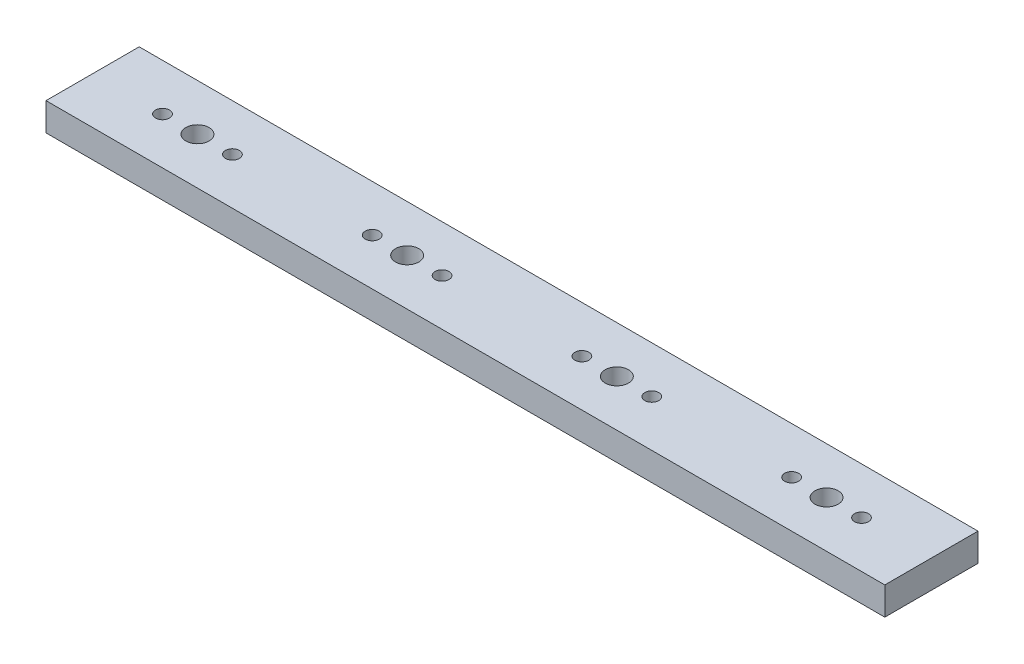
ISO-10303-21;
HEADER;
FILE_DESCRIPTION(('STEP AP214'),'2;1');
FILE_NAME('part.step','',(''),(''),'','','');
FILE_SCHEMA(('AUTOMOTIVE_DESIGN { 1 0 10303 214 1 1 1 1 }'));
ENDSEC;
DATA;
#1=APPLICATION_CONTEXT('core data for automotive mechanical design processes');
#2=APPLICATION_PROTOCOL_DEFINITION('international standard','automotive_design',2000,#1);
#3=PRODUCT_CONTEXT('',#1,'mechanical');
#4=PRODUCT('Part','Part','',(#3));
#5=PRODUCT_RELATED_PRODUCT_CATEGORY('part','',(#4));
#6=PRODUCT_DEFINITION_FORMATION('','',#4);
#7=PRODUCT_DEFINITION_CONTEXT('part definition',#1,'design');
#8=PRODUCT_DEFINITION('design','',#6,#7);
#9=PRODUCT_DEFINITION_SHAPE('','',#8);
#10=(LENGTH_UNIT() NAMED_UNIT(*) SI_UNIT(.MILLI.,.METRE.));
#11=(NAMED_UNIT(*) PLANE_ANGLE_UNIT() SI_UNIT($,.RADIAN.));
#12=(NAMED_UNIT(*) SI_UNIT($,.STERADIAN.) SOLID_ANGLE_UNIT());
#13=UNCERTAINTY_MEASURE_WITH_UNIT(LENGTH_MEASURE(1.E-05),#10,'distance_accuracy_value','');
#14=(GEOMETRIC_REPRESENTATION_CONTEXT(3) GLOBAL_UNCERTAINTY_ASSIGNED_CONTEXT((#13)) GLOBAL_UNIT_ASSIGNED_CONTEXT((#10,
#11,#12)) REPRESENTATION_CONTEXT('',''));
#15=CARTESIAN_POINT('',(0.,0.,0.));
#16=DIRECTION('',(0.,0.,1.));
#17=DIRECTION('',(1.,0.,0.));
#18=AXIS2_PLACEMENT_3D('',#15,#16,#17);
#19=CARTESIAN_POINT('',(180.,12.,20.));
#20=DIRECTION('',(-1.,0.,0.));
#21=DIRECTION('',(0.,0.,1.));
#22=AXIS2_PLACEMENT_3D('',#19,#20,#21);
#23=PLANE('',#22);
#24=DIRECTION('',(0.,0.,-1.));
#25=VECTOR('',#24,1.);
#26=CARTESIAN_POINT('',(180.,0.,20.));
#27=LINE('',#26,#25);
#28=CARTESIAN_POINT('',(180.,0.,20.));
#29=VERTEX_POINT('',#28);
#30=CARTESIAN_POINT('',(180.,0.,-20.));
#31=VERTEX_POINT('',#30);
#32=EDGE_CURVE('E102',#29,#31,#27,.T.);
#33=ORIENTED_EDGE('',*,*,#32,.T.);
#34=DIRECTION('',(0.,-1.,0.));
#35=VECTOR('',#34,1.);
#36=CARTESIAN_POINT('',(180.,12.,-20.));
#37=LINE('',#36,#35);
#38=CARTESIAN_POINT('',(180.,12.,-20.));
#39=VERTEX_POINT('',#38);
#40=EDGE_CURVE('E93',#39,#31,#37,.T.);
#41=ORIENTED_EDGE('',*,*,#40,.F.);
#42=DIRECTION('',(0.,0.,-1.));
#43=VECTOR('',#42,1.);
#44=CARTESIAN_POINT('',(180.,12.,20.));
#45=LINE('',#44,#43);
#46=CARTESIAN_POINT('',(180.,12.,20.));
#47=VERTEX_POINT('',#46);
#48=EDGE_CURVE('E87',#47,#39,#45,.T.);
#49=ORIENTED_EDGE('',*,*,#48,.F.);
#50=DIRECTION('',(0.,-1.,0.));
#51=VECTOR('',#50,1.);
#52=CARTESIAN_POINT('',(180.,12.,20.));
#53=LINE('',#52,#51);
#54=EDGE_CURVE('E98',#47,#29,#53,.T.);
#55=ORIENTED_EDGE('',*,*,#54,.T.);
#56=EDGE_LOOP('',(#33,#41,#49,#55));
#57=FACE_BOUND('',#56,.T.);
#58=ADVANCED_FACE('F33',(#57),#23,.F.);
#59=CARTESIAN_POINT('',(-180.,12.,-20.));
#60=DIRECTION('',(0.,0.,1.));
#61=DIRECTION('',(1.,0.,0.));
#62=AXIS2_PLACEMENT_3D('',#59,#60,#61);
#63=PLANE('',#62);
#64=DIRECTION('',(-1.,0.,0.));
#65=VECTOR('',#64,1.);
#66=CARTESIAN_POINT('',(-180.,0.,-20.));
#67=LINE('',#66,#65);
#68=CARTESIAN_POINT('',(-180.,0.,-20.));
#69=VERTEX_POINT('',#68);
#70=EDGE_CURVE('E92',#31,#69,#67,.T.);
#71=ORIENTED_EDGE('',*,*,#70,.T.);
#72=DIRECTION('',(0.,-1.,0.));
#73=VECTOR('',#72,1.);
#74=CARTESIAN_POINT('',(-180.,12.,-20.));
#75=LINE('',#74,#73);
#76=CARTESIAN_POINT('',(-180.,12.,-20.));
#77=VERTEX_POINT('',#76);
#78=EDGE_CURVE('E90',#77,#69,#75,.T.);
#79=ORIENTED_EDGE('',*,*,#78,.F.);
#80=DIRECTION('',(-1.,0.,0.));
#81=VECTOR('',#80,1.);
#82=CARTESIAN_POINT('',(-180.,12.,-20.));
#83=LINE('',#82,#81);
#84=EDGE_CURVE('E81',#39,#77,#83,.T.);
#85=ORIENTED_EDGE('',*,*,#84,.F.);
#86=ORIENTED_EDGE('',*,*,#40,.T.);
#87=EDGE_LOOP('',(#71,#79,#85,#86));
#88=FACE_BOUND('',#87,.T.);
#89=ADVANCED_FACE('F91',(#88),#63,.F.);
#90=CARTESIAN_POINT('',(-180.,12.,20.));
#91=DIRECTION('',(1.,0.,0.));
#92=DIRECTION('',(0.,0.,-1.));
#93=AXIS2_PLACEMENT_3D('',#90,#91,#92);
#94=PLANE('',#93);
#95=DIRECTION('',(0.,0.,1.));
#96=VECTOR('',#95,1.);
#97=CARTESIAN_POINT('',(-180.,0.,20.));
#98=LINE('',#97,#96);
#99=CARTESIAN_POINT('',(-180.,0.,20.));
#100=VERTEX_POINT('',#99);
#101=EDGE_CURVE('E67',#69,#100,#98,.T.);
#102=ORIENTED_EDGE('',*,*,#101,.T.);
#103=DIRECTION('',(0.,-1.,0.));
#104=VECTOR('',#103,1.);
#105=CARTESIAN_POINT('',(-180.,12.,20.));
#106=LINE('',#105,#104);
#107=CARTESIAN_POINT('',(-180.,12.,20.));
#108=VERTEX_POINT('',#107);
#109=EDGE_CURVE('E94',#108,#100,#106,.T.);
#110=ORIENTED_EDGE('',*,*,#109,.F.);
#111=DIRECTION('',(0.,0.,1.));
#112=VECTOR('',#111,1.);
#113=CARTESIAN_POINT('',(-180.,12.,20.));
#114=LINE('',#113,#112);
#115=EDGE_CURVE('E85',#77,#108,#114,.T.);
#116=ORIENTED_EDGE('',*,*,#115,.F.);
#117=ORIENTED_EDGE('',*,*,#78,.T.);
#118=EDGE_LOOP('',(#102,#110,#116,#117));
#119=FACE_BOUND('',#118,.T.);
#120=ADVANCED_FACE('F96',(#119),#94,.F.);
#121=CARTESIAN_POINT('',(-180.,12.,20.));
#122=DIRECTION('',(0.,0.,-1.));
#123=DIRECTION('',(-1.,0.,0.));
#124=AXIS2_PLACEMENT_3D('',#121,#122,#123);
#125=PLANE('',#124);
#126=DIRECTION('',(1.,0.,0.));
#127=VECTOR('',#126,1.);
#128=CARTESIAN_POINT('',(-180.,0.,20.));
#129=LINE('',#128,#127);
#130=EDGE_CURVE('E73',#100,#29,#129,.T.);
#131=ORIENTED_EDGE('',*,*,#130,.T.);
#132=ORIENTED_EDGE('',*,*,#54,.F.);
#133=DIRECTION('',(1.,0.,0.));
#134=VECTOR('',#133,1.);
#135=CARTESIAN_POINT('',(-180.,12.,20.));
#136=LINE('',#135,#134);
#137=EDGE_CURVE('E50',#108,#47,#136,.T.);
#138=ORIENTED_EDGE('',*,*,#137,.F.);
#139=ORIENTED_EDGE('',*,*,#109,.T.);
#140=EDGE_LOOP('',(#131,#132,#138,#139));
#141=FACE_BOUND('',#140,.T.);
#142=ADVANCED_FACE('F152',(#141),#125,.F.);
#143=CARTESIAN_POINT('',(180.,12.,-20.));
#144=DIRECTION('',(0.,-1.,0.));
#145=DIRECTION('',(0.,0.,-1.));
#146=AXIS2_PLACEMENT_3D('',#143,#144,#145);
#147=PLANE('',#146);
#148=CARTESIAN_POINT('',(-30.,12.,0.));
#149=DIRECTION('',(0.,1.,0.));
#150=DIRECTION('',(0.,0.,1.));
#151=AXIS2_PLACEMENT_3D('',#148,#149,#150);
#152=CIRCLE('',#151,3.00000000000001);
#153=CARTESIAN_POINT('',(-30.,12.,3.00000000000001));
#154=VERTEX_POINT('',#153);
#155=EDGE_CURVE('E261',#154,#154,#152,.T.);
#156=ORIENTED_EDGE('',*,*,#155,.F.);
#157=EDGE_LOOP('',(#156));
#158=FACE_BOUND('',#157,.T.);
#159=CARTESIAN_POINT('',(-60.,12.,0.));
#160=DIRECTION('',(0.,1.,0.));
#161=DIRECTION('',(0.,0.,1.));
#162=AXIS2_PLACEMENT_3D('',#159,#160,#161);
#163=CIRCLE('',#162,2.99999999999999);
#164=CARTESIAN_POINT('',(-60.,12.,2.99999999999999));
#165=VERTEX_POINT('',#164);
#166=EDGE_CURVE('E255',#165,#165,#163,.T.);
#167=ORIENTED_EDGE('',*,*,#166,.F.);
#168=EDGE_LOOP('',(#167));
#169=FACE_BOUND('',#168,.T.);
#170=CARTESIAN_POINT('',(-45.,12.,0.));
#171=DIRECTION('',(0.,1.,0.));
#172=DIRECTION('',(0.,0.,1.));
#173=AXIS2_PLACEMENT_3D('',#170,#171,#172);
#174=CIRCLE('',#173,4.99999999999999);
#175=CARTESIAN_POINT('',(-45.,12.,4.99999999999999));
#176=VERTEX_POINT('',#175);
#177=EDGE_CURVE('E247',#176,#176,#174,.T.);
#178=ORIENTED_EDGE('',*,*,#177,.F.);
#179=EDGE_LOOP('',(#178));
#180=FACE_BOUND('',#179,.T.);
#181=CARTESIAN_POINT('',(-135.,12.,0.));
#182=DIRECTION('',(0.,1.,0.));
#183=DIRECTION('',(0.,0.,1.));
#184=AXIS2_PLACEMENT_3D('',#181,#182,#183);
#185=CIRCLE('',#184,4.99999999999999);
#186=CARTESIAN_POINT('',(-135.,12.,4.99999999999999));
#187=VERTEX_POINT('',#186);
#188=EDGE_CURVE('E241',#187,#187,#185,.T.);
#189=ORIENTED_EDGE('',*,*,#188,.F.);
#190=EDGE_LOOP('',(#189));
#191=FACE_BOUND('',#190,.T.);
#192=CARTESIAN_POINT('',(-120.,12.,0.));
#193=DIRECTION('',(0.,1.,0.));
#194=DIRECTION('',(0.,0.,1.));
#195=AXIS2_PLACEMENT_3D('',#192,#193,#194);
#196=CIRCLE('',#195,3.00000000000001);
#197=CARTESIAN_POINT('',(-120.,12.,3.00000000000001));
#198=VERTEX_POINT('',#197);
#199=EDGE_CURVE('E235',#198,#198,#196,.T.);
#200=ORIENTED_EDGE('',*,*,#199,.F.);
#201=EDGE_LOOP('',(#200));
#202=FACE_BOUND('',#201,.T.);
#203=CARTESIAN_POINT('',(-150.,12.,0.));
#204=DIRECTION('',(0.,1.,0.));
#205=DIRECTION('',(0.,0.,1.));
#206=AXIS2_PLACEMENT_3D('',#203,#204,#205);
#207=CIRCLE('',#206,2.99999999999999);
#208=CARTESIAN_POINT('',(-150.,12.,2.99999999999999));
#209=VERTEX_POINT('',#208);
#210=EDGE_CURVE('E105',#209,#209,#207,.T.);
#211=ORIENTED_EDGE('',*,*,#210,.F.);
#212=EDGE_LOOP('',(#211));
#213=FACE_BOUND('',#212,.T.);
#214=ORIENTED_EDGE('',*,*,#48,.T.);
#215=ORIENTED_EDGE('',*,*,#84,.T.);
#216=ORIENTED_EDGE('',*,*,#115,.T.);
#217=ORIENTED_EDGE('',*,*,#137,.T.);
#218=EDGE_LOOP('',(#214,#215,#216,#217));
#219=FACE_BOUND('',#218,.T.);
#220=CARTESIAN_POINT('',(45.,12.,0.));
#221=DIRECTION('',(0.,1.,0.));
#222=DIRECTION('',(0.,0.,1.));
#223=AXIS2_PLACEMENT_3D('',#220,#221,#222);
#224=CIRCLE('',#223,4.99999999999999);
#225=CARTESIAN_POINT('',(45.,12.,4.99999999999999));
#226=VERTEX_POINT('',#225);
#227=EDGE_CURVE('E115',#226,#226,#224,.T.);
#228=ORIENTED_EDGE('',*,*,#227,.F.);
#229=EDGE_LOOP('',(#228));
#230=FACE_BOUND('',#229,.T.);
#231=CARTESIAN_POINT('',(135.,12.,0.));
#232=DIRECTION('',(0.,1.,0.));
#233=DIRECTION('',(0.,0.,1.));
#234=AXIS2_PLACEMENT_3D('',#231,#232,#233);
#235=CIRCLE('',#234,4.99999999999999);
#236=CARTESIAN_POINT('',(135.,12.,4.99999999999999));
#237=VERTEX_POINT('',#236);
#238=EDGE_CURVE('E121',#237,#237,#235,.T.);
#239=ORIENTED_EDGE('',*,*,#238,.F.);
#240=EDGE_LOOP('',(#239));
#241=FACE_BOUND('',#240,.T.);
#242=CARTESIAN_POINT('',(30.,12.,0.));
#243=DIRECTION('',(0.,1.,0.));
#244=DIRECTION('',(0.,0.,1.));
#245=AXIS2_PLACEMENT_3D('',#242,#243,#244);
#246=CIRCLE('',#245,2.99999999999999);
#247=CARTESIAN_POINT('',(30.,12.,2.99999999999999));
#248=VERTEX_POINT('',#247);
#249=EDGE_CURVE('E127',#248,#248,#246,.T.);
#250=ORIENTED_EDGE('',*,*,#249,.F.);
#251=EDGE_LOOP('',(#250));
#252=FACE_BOUND('',#251,.T.);
#253=CARTESIAN_POINT('',(120.,12.,0.));
#254=DIRECTION('',(0.,1.,0.));
#255=DIRECTION('',(0.,0.,1.));
#256=AXIS2_PLACEMENT_3D('',#253,#254,#255);
#257=CIRCLE('',#256,2.99999999999999);
#258=CARTESIAN_POINT('',(120.,12.,2.99999999999999));
#259=VERTEX_POINT('',#258);
#260=EDGE_CURVE('E133',#259,#259,#257,.T.);
#261=ORIENTED_EDGE('',*,*,#260,.F.);
#262=EDGE_LOOP('',(#261));
#263=FACE_BOUND('',#262,.T.);
#264=CARTESIAN_POINT('',(60.,12.,0.));
#265=DIRECTION('',(0.,1.,0.));
#266=DIRECTION('',(0.,0.,1.));
#267=AXIS2_PLACEMENT_3D('',#264,#265,#266);
#268=CIRCLE('',#267,3.00000000000001);
#269=CARTESIAN_POINT('',(60.,12.,3.00000000000001));
#270=VERTEX_POINT('',#269);
#271=EDGE_CURVE('E139',#270,#270,#268,.T.);
#272=ORIENTED_EDGE('',*,*,#271,.F.);
#273=EDGE_LOOP('',(#272));
#274=FACE_BOUND('',#273,.T.);
#275=CARTESIAN_POINT('',(150.,12.,0.));
#276=DIRECTION('',(0.,1.,0.));
#277=DIRECTION('',(0.,0.,1.));
#278=AXIS2_PLACEMENT_3D('',#275,#276,#277);
#279=CIRCLE('',#278,3.00000000000001);
#280=CARTESIAN_POINT('',(150.,12.,3.00000000000001));
#281=VERTEX_POINT('',#280);
#282=EDGE_CURVE('E11',#281,#281,#279,.T.);
#283=ORIENTED_EDGE('',*,*,#282,.F.);
#284=EDGE_LOOP('',(#283));
#285=FACE_BOUND('',#284,.T.);
#286=ADVANCED_FACE('F82',(#158,#169,#180,#191,#202,#213,#219,#230,#241,#252,#263,#274,#285),
#147,.F.);
#287=CARTESIAN_POINT('',(180.,0.,-20.));
#288=DIRECTION('',(0.,-1.,0.));
#289=DIRECTION('',(0.,0.,-1.));
#290=AXIS2_PLACEMENT_3D('',#287,#288,#289);
#291=PLANE('',#290);
#292=CARTESIAN_POINT('',(-30.,0.,0.));
#293=DIRECTION('',(0.,-1.,0.));
#294=DIRECTION('',(0.,0.,-1.));
#295=AXIS2_PLACEMENT_3D('',#292,#293,#294);
#296=CIRCLE('',#295,3.00000000000001);
#297=CARTESIAN_POINT('',(-30.,0.,-3.00000000000001));
#298=VERTEX_POINT('',#297);
#299=EDGE_CURVE('E264',#298,#298,#296,.F.);
#300=ORIENTED_EDGE('',*,*,#299,.T.);
#301=EDGE_LOOP('',(#300));
#302=FACE_BOUND('',#301,.T.);
#303=CARTESIAN_POINT('',(-60.,0.,0.));
#304=DIRECTION('',(0.,-1.,0.));
#305=DIRECTION('',(0.,0.,-1.));
#306=AXIS2_PLACEMENT_3D('',#303,#304,#305);
#307=CIRCLE('',#306,2.99999999999999);
#308=CARTESIAN_POINT('',(-60.,0.,-2.99999999999999));
#309=VERTEX_POINT('',#308);
#310=EDGE_CURVE('E258',#309,#309,#307,.F.);
#311=ORIENTED_EDGE('',*,*,#310,.T.);
#312=EDGE_LOOP('',(#311));
#313=FACE_BOUND('',#312,.T.);
#314=CARTESIAN_POINT('',(-45.,0.,0.));
#315=DIRECTION('',(0.,-1.,0.));
#316=DIRECTION('',(0.,0.,-1.));
#317=AXIS2_PLACEMENT_3D('',#314,#315,#316);
#318=CIRCLE('',#317,4.99999999999999);
#319=CARTESIAN_POINT('',(-45.,0.,-4.99999999999999));
#320=VERTEX_POINT('',#319);
#321=EDGE_CURVE('E252',#320,#320,#318,.F.);
#322=ORIENTED_EDGE('',*,*,#321,.T.);
#323=EDGE_LOOP('',(#322));
#324=FACE_BOUND('',#323,.T.);
#325=CARTESIAN_POINT('',(-135.,0.,0.));
#326=DIRECTION('',(0.,-1.,0.));
#327=DIRECTION('',(0.,0.,-1.));
#328=AXIS2_PLACEMENT_3D('',#325,#326,#327);
#329=CIRCLE('',#328,4.99999999999999);
#330=CARTESIAN_POINT('',(-135.,0.,-4.99999999999999));
#331=VERTEX_POINT('',#330);
#332=EDGE_CURVE('E244',#331,#331,#329,.F.);
#333=ORIENTED_EDGE('',*,*,#332,.T.);
#334=EDGE_LOOP('',(#333));
#335=FACE_BOUND('',#334,.T.);
#336=CARTESIAN_POINT('',(-120.,0.,0.));
#337=DIRECTION('',(0.,-1.,0.));
#338=DIRECTION('',(0.,0.,-1.));
#339=AXIS2_PLACEMENT_3D('',#336,#337,#338);
#340=CIRCLE('',#339,3.00000000000001);
#341=CARTESIAN_POINT('',(-120.,0.,-3.00000000000001));
#342=VERTEX_POINT('',#341);
#343=EDGE_CURVE('E238',#342,#342,#340,.F.);
#344=ORIENTED_EDGE('',*,*,#343,.T.);
#345=EDGE_LOOP('',(#344));
#346=FACE_BOUND('',#345,.T.);
#347=CARTESIAN_POINT('',(-150.,0.,0.));
#348=DIRECTION('',(0.,-1.,0.));
#349=DIRECTION('',(0.,0.,-1.));
#350=AXIS2_PLACEMENT_3D('',#347,#348,#349);
#351=CIRCLE('',#350,2.99999999999999);
#352=CARTESIAN_POINT('',(-150.,0.,-2.99999999999999));
#353=VERTEX_POINT('',#352);
#354=EDGE_CURVE('E230',#353,#353,#351,.F.);
#355=ORIENTED_EDGE('',*,*,#354,.T.);
#356=EDGE_LOOP('',(#355));
#357=FACE_BOUND('',#356,.T.);
#358=ORIENTED_EDGE('',*,*,#32,.F.);
#359=ORIENTED_EDGE('',*,*,#130,.F.);
#360=ORIENTED_EDGE('',*,*,#101,.F.);
#361=ORIENTED_EDGE('',*,*,#70,.F.);
#362=EDGE_LOOP('',(#358,#359,#360,#361));
#363=FACE_BOUND('',#362,.T.);
#364=CARTESIAN_POINT('',(45.,0.,0.));
#365=DIRECTION('',(0.,-1.,0.));
#366=DIRECTION('',(0.,0.,-1.));
#367=AXIS2_PLACEMENT_3D('',#364,#365,#366);
#368=CIRCLE('',#367,4.99999999999999);
#369=CARTESIAN_POINT('',(45.,0.,-4.99999999999999));
#370=VERTEX_POINT('',#369);
#371=EDGE_CURVE('E112',#370,#370,#368,.F.);
#372=ORIENTED_EDGE('',*,*,#371,.T.);
#373=EDGE_LOOP('',(#372));
#374=FACE_BOUND('',#373,.T.);
#375=CARTESIAN_POINT('',(135.,0.,0.));
#376=DIRECTION('',(0.,-1.,0.));
#377=DIRECTION('',(0.,0.,-1.));
#378=AXIS2_PLACEMENT_3D('',#375,#376,#377);
#379=CIRCLE('',#378,4.99999999999999);
#380=CARTESIAN_POINT('',(135.,0.,-4.99999999999999));
#381=VERTEX_POINT('',#380);
#382=EDGE_CURVE('E118',#381,#381,#379,.F.);
#383=ORIENTED_EDGE('',*,*,#382,.T.);
#384=EDGE_LOOP('',(#383));
#385=FACE_BOUND('',#384,.T.);
#386=CARTESIAN_POINT('',(30.,0.,0.));
#387=DIRECTION('',(0.,-1.,0.));
#388=DIRECTION('',(0.,0.,-1.));
#389=AXIS2_PLACEMENT_3D('',#386,#387,#388);
#390=CIRCLE('',#389,2.99999999999999);
#391=CARTESIAN_POINT('',(30.,0.,-2.99999999999999));
#392=VERTEX_POINT('',#391);
#393=EDGE_CURVE('E124',#392,#392,#390,.F.);
#394=ORIENTED_EDGE('',*,*,#393,.T.);
#395=EDGE_LOOP('',(#394));
#396=FACE_BOUND('',#395,.T.);
#397=CARTESIAN_POINT('',(120.,0.,0.));
#398=DIRECTION('',(0.,-1.,0.));
#399=DIRECTION('',(0.,0.,-1.));
#400=AXIS2_PLACEMENT_3D('',#397,#398,#399);
#401=CIRCLE('',#400,2.99999999999999);
#402=CARTESIAN_POINT('',(120.,0.,-2.99999999999999));
#403=VERTEX_POINT('',#402);
#404=EDGE_CURVE('E130',#403,#403,#401,.F.);
#405=ORIENTED_EDGE('',*,*,#404,.T.);
#406=EDGE_LOOP('',(#405));
#407=FACE_BOUND('',#406,.T.);
#408=CARTESIAN_POINT('',(60.,0.,0.));
#409=DIRECTION('',(0.,-1.,0.));
#410=DIRECTION('',(0.,0.,-1.));
#411=AXIS2_PLACEMENT_3D('',#408,#409,#410);
#412=CIRCLE('',#411,3.00000000000001);
#413=CARTESIAN_POINT('',(60.,0.,-3.00000000000001));
#414=VERTEX_POINT('',#413);
#415=EDGE_CURVE('E136',#414,#414,#412,.F.);
#416=ORIENTED_EDGE('',*,*,#415,.T.);
#417=EDGE_LOOP('',(#416));
#418=FACE_BOUND('',#417,.T.);
#419=CARTESIAN_POINT('',(150.,0.,0.));
#420=DIRECTION('',(0.,-1.,0.));
#421=DIRECTION('',(0.,0.,-1.));
#422=AXIS2_PLACEMENT_3D('',#419,#420,#421);
#423=CIRCLE('',#422,3.00000000000001);
#424=CARTESIAN_POINT('',(150.,0.,-3.00000000000001));
#425=VERTEX_POINT('',#424);
#426=EDGE_CURVE('E42',#425,#425,#423,.F.);
#427=ORIENTED_EDGE('',*,*,#426,.T.);
#428=EDGE_LOOP('',(#427));
#429=FACE_BOUND('',#428,.T.);
#430=ADVANCED_FACE('F144',(#302,#313,#324,#335,#346,#357,#363,#374,#385,#396,#407,#418,#429),
#291,.T.);
#431=CARTESIAN_POINT('',(-150.,-0.000999999999999265,0.));
#432=DIRECTION('',(0.,1.,0.));
#433=DIRECTION('',(0.,0.,1.));
#434=AXIS2_PLACEMENT_3D('',#431,#432,#433);
#435=CYLINDRICAL_SURFACE('',#434,2.99999999999999);
#436=ORIENTED_EDGE('',*,*,#354,.F.);
#437=EDGE_LOOP('',(#436));
#438=FACE_BOUND('',#437,.T.);
#439=ORIENTED_EDGE('',*,*,#210,.T.);
#440=EDGE_LOOP('',(#439));
#441=FACE_BOUND('',#440,.T.);
#442=ADVANCED_FACE('F159',(#438,#441),#435,.F.);
#443=CARTESIAN_POINT('',(-120.,-0.000999999999999265,0.));
#444=DIRECTION('',(0.,1.,0.));
#445=DIRECTION('',(0.,0.,1.));
#446=AXIS2_PLACEMENT_3D('',#443,#444,#445);
#447=CYLINDRICAL_SURFACE('',#446,3.00000000000001);
#448=ORIENTED_EDGE('',*,*,#343,.F.);
#449=EDGE_LOOP('',(#448));
#450=FACE_BOUND('',#449,.T.);
#451=ORIENTED_EDGE('',*,*,#199,.T.);
#452=EDGE_LOOP('',(#451));
#453=FACE_BOUND('',#452,.T.);
#454=ADVANCED_FACE('F219',(#450,#453),#447,.F.);
#455=CARTESIAN_POINT('',(-135.,-0.000999999999999265,0.));
#456=DIRECTION('',(0.,1.,0.));
#457=DIRECTION('',(0.,0.,1.));
#458=AXIS2_PLACEMENT_3D('',#455,#456,#457);
#459=CYLINDRICAL_SURFACE('',#458,4.99999999999999);
#460=ORIENTED_EDGE('',*,*,#332,.F.);
#461=EDGE_LOOP('',(#460));
#462=FACE_BOUND('',#461,.T.);
#463=ORIENTED_EDGE('',*,*,#188,.T.);
#464=EDGE_LOOP('',(#463));
#465=FACE_BOUND('',#464,.T.);
#466=ADVANCED_FACE('F215',(#462,#465),#459,.F.);
#467=CARTESIAN_POINT('',(-45.,-0.000999999999999265,0.));
#468=DIRECTION('',(0.,1.,0.));
#469=DIRECTION('',(0.,0.,1.));
#470=AXIS2_PLACEMENT_3D('',#467,#468,#469);
#471=CYLINDRICAL_SURFACE('',#470,4.99999999999999);
#472=ORIENTED_EDGE('',*,*,#321,.F.);
#473=EDGE_LOOP('',(#472));
#474=FACE_BOUND('',#473,.T.);
#475=ORIENTED_EDGE('',*,*,#177,.T.);
#476=EDGE_LOOP('',(#475));
#477=FACE_BOUND('',#476,.T.);
#478=ADVANCED_FACE('F179',(#474,#477),#471,.F.);
#479=CARTESIAN_POINT('',(45.,-0.000999999999999265,0.));
#480=DIRECTION('',(0.,1.,0.));
#481=DIRECTION('',(0.,0.,1.));
#482=AXIS2_PLACEMENT_3D('',#479,#480,#481);
#483=CYLINDRICAL_SURFACE('',#482,4.99999999999999);
#484=ORIENTED_EDGE('',*,*,#371,.F.);
#485=EDGE_LOOP('',(#484));
#486=FACE_BOUND('',#485,.T.);
#487=ORIENTED_EDGE('',*,*,#227,.T.);
#488=EDGE_LOOP('',(#487));
#489=FACE_BOUND('',#488,.T.);
#490=ADVANCED_FACE('F175',(#486,#489),#483,.F.);
#491=CARTESIAN_POINT('',(135.,-0.000999999999999265,0.));
#492=DIRECTION('',(0.,1.,0.));
#493=DIRECTION('',(0.,0.,1.));
#494=AXIS2_PLACEMENT_3D('',#491,#492,#493);
#495=CYLINDRICAL_SURFACE('',#494,4.99999999999999);
#496=ORIENTED_EDGE('',*,*,#382,.F.);
#497=EDGE_LOOP('',(#496));
#498=FACE_BOUND('',#497,.T.);
#499=ORIENTED_EDGE('',*,*,#238,.T.);
#500=EDGE_LOOP('',(#499));
#501=FACE_BOUND('',#500,.T.);
#502=ADVANCED_FACE('F178',(#498,#501),#495,.F.);
#503=CARTESIAN_POINT('',(-60.,-0.000999999999999265,0.));
#504=DIRECTION('',(0.,1.,0.));
#505=DIRECTION('',(0.,0.,1.));
#506=AXIS2_PLACEMENT_3D('',#503,#504,#505);
#507=CYLINDRICAL_SURFACE('',#506,2.99999999999999);
#508=ORIENTED_EDGE('',*,*,#310,.F.);
#509=EDGE_LOOP('',(#508));
#510=FACE_BOUND('',#509,.T.);
#511=ORIENTED_EDGE('',*,*,#166,.T.);
#512=EDGE_LOOP('',(#511));
#513=FACE_BOUND('',#512,.T.);
#514=ADVANCED_FACE('F183',(#510,#513),#507,.F.);
#515=CARTESIAN_POINT('',(30.,-0.000999999999999265,0.));
#516=DIRECTION('',(0.,1.,0.));
#517=DIRECTION('',(0.,0.,1.));
#518=AXIS2_PLACEMENT_3D('',#515,#516,#517);
#519=CYLINDRICAL_SURFACE('',#518,2.99999999999999);
#520=ORIENTED_EDGE('',*,*,#393,.F.);
#521=EDGE_LOOP('',(#520));
#522=FACE_BOUND('',#521,.T.);
#523=ORIENTED_EDGE('',*,*,#249,.T.);
#524=EDGE_LOOP('',(#523));
#525=FACE_BOUND('',#524,.T.);
#526=ADVANCED_FACE('F185',(#522,#525),#519,.F.);
#527=CARTESIAN_POINT('',(120.,-0.000999999999999265,0.));
#528=DIRECTION('',(0.,1.,0.));
#529=DIRECTION('',(0.,0.,1.));
#530=AXIS2_PLACEMENT_3D('',#527,#528,#529);
#531=CYLINDRICAL_SURFACE('',#530,2.99999999999999);
#532=ORIENTED_EDGE('',*,*,#404,.F.);
#533=EDGE_LOOP('',(#532));
#534=FACE_BOUND('',#533,.T.);
#535=ORIENTED_EDGE('',*,*,#260,.T.);
#536=EDGE_LOOP('',(#535));
#537=FACE_BOUND('',#536,.T.);
#538=ADVANCED_FACE('F188',(#534,#537),#531,.F.);
#539=CARTESIAN_POINT('',(-30.,-0.000999999999999265,0.));
#540=DIRECTION('',(0.,1.,0.));
#541=DIRECTION('',(0.,0.,1.));
#542=AXIS2_PLACEMENT_3D('',#539,#540,#541);
#543=CYLINDRICAL_SURFACE('',#542,3.00000000000001);
#544=ORIENTED_EDGE('',*,*,#299,.F.);
#545=EDGE_LOOP('',(#544));
#546=FACE_BOUND('',#545,.T.);
#547=ORIENTED_EDGE('',*,*,#155,.T.);
#548=EDGE_LOOP('',(#547));
#549=FACE_BOUND('',#548,.T.);
#550=ADVANCED_FACE('F191',(#546,#549),#543,.F.);
#551=CARTESIAN_POINT('',(60.,-0.000999999999999265,0.));
#552=DIRECTION('',(0.,1.,0.));
#553=DIRECTION('',(0.,0.,1.));
#554=AXIS2_PLACEMENT_3D('',#551,#552,#553);
#555=CYLINDRICAL_SURFACE('',#554,3.00000000000001);
#556=ORIENTED_EDGE('',*,*,#415,.F.);
#557=EDGE_LOOP('',(#556));
#558=FACE_BOUND('',#557,.T.);
#559=ORIENTED_EDGE('',*,*,#271,.T.);
#560=EDGE_LOOP('',(#559));
#561=FACE_BOUND('',#560,.T.);
#562=ADVANCED_FACE('F148',(#558,#561),#555,.F.);
#563=CARTESIAN_POINT('',(150.,-0.000999999999999265,0.));
#564=DIRECTION('',(0.,1.,0.));
#565=DIRECTION('',(0.,0.,1.));
#566=AXIS2_PLACEMENT_3D('',#563,#564,#565);
#567=CYLINDRICAL_SURFACE('',#566,3.00000000000001);
#568=ORIENTED_EDGE('',*,*,#426,.F.);
#569=EDGE_LOOP('',(#568));
#570=FACE_BOUND('',#569,.T.);
#571=ORIENTED_EDGE('',*,*,#282,.T.);
#572=EDGE_LOOP('',(#571));
#573=FACE_BOUND('',#572,.T.);
#574=ADVANCED_FACE('F35',(#570,#573),#567,.F.);
#575=CLOSED_SHELL('',(#58,#89,#120,#142,#286,#430,#442,#454,#466,#478,#490,#502,#514,#526,#538,
#550,#562,#574));
#576=MANIFOLD_SOLID_BREP('B2',#575);
#577=ADVANCED_BREP_SHAPE_REPRESENTATION('',(#18,#576),#14);
#578=SHAPE_DEFINITION_REPRESENTATION(#9,#577);
ENDSEC;
END-ISO-10303-21;
